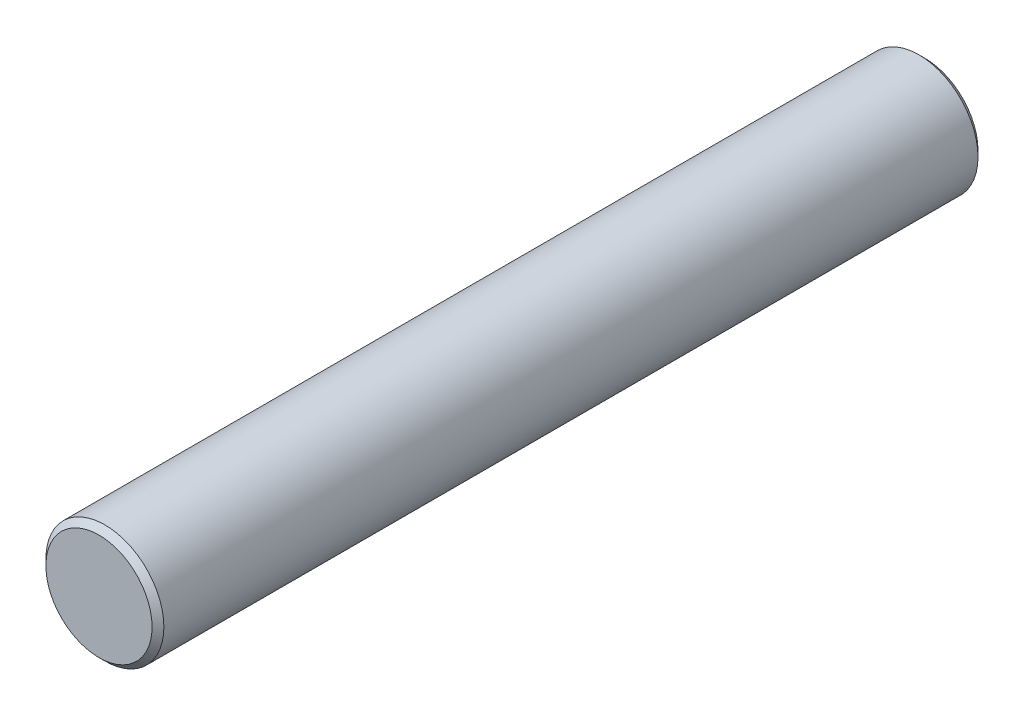
ISO-10303-21;
HEADER;
FILE_DESCRIPTION(('STEP AP214'),'2;1');
FILE_NAME('part.step','',(''),(''),'','','');
FILE_SCHEMA(('AUTOMOTIVE_DESIGN { 1 0 10303 214 1 1 1 1 }'));
ENDSEC;
DATA;
#1=APPLICATION_CONTEXT('core data for automotive mechanical design processes');
#2=APPLICATION_PROTOCOL_DEFINITION('international standard','automotive_design',2000,#1);
#3=PRODUCT_CONTEXT('',#1,'mechanical');
#4=PRODUCT('Part','Part','',(#3));
#5=PRODUCT_RELATED_PRODUCT_CATEGORY('part','',(#4));
#6=PRODUCT_DEFINITION_FORMATION('','',#4);
#7=PRODUCT_DEFINITION_CONTEXT('part definition',#1,'design');
#8=PRODUCT_DEFINITION('design','',#6,#7);
#9=PRODUCT_DEFINITION_SHAPE('','',#8);
#10=(LENGTH_UNIT() NAMED_UNIT(*) SI_UNIT(.MILLI.,.METRE.));
#11=(NAMED_UNIT(*) PLANE_ANGLE_UNIT() SI_UNIT($,.RADIAN.));
#12=(NAMED_UNIT(*) SI_UNIT($,.STERADIAN.) SOLID_ANGLE_UNIT());
#13=UNCERTAINTY_MEASURE_WITH_UNIT(LENGTH_MEASURE(1.E-05),#10,'distance_accuracy_value','');
#14=(GEOMETRIC_REPRESENTATION_CONTEXT(3) GLOBAL_UNCERTAINTY_ASSIGNED_CONTEXT((#13)) GLOBAL_UNIT_ASSIGNED_CONTEXT((#10,
#11,#12)) REPRESENTATION_CONTEXT('',''));
#15=CARTESIAN_POINT('',(0.,0.,0.));
#16=DIRECTION('',(0.,0.,1.));
#17=DIRECTION('',(1.,0.,0.));
#18=AXIS2_PLACEMENT_3D('',#15,#16,#17);
#19=CARTESIAN_POINT('',(0.,0.,35.));
#20=DIRECTION('',(0.,0.,-1.));
#21=DIRECTION('',(-1.,0.,0.));
#22=AXIS2_PLACEMENT_3D('',#19,#20,#21);
#23=CYLINDRICAL_SURFACE('',#22,2.5);
#24=CARTESIAN_POINT('',(0.,0.,0.25));
#25=DIRECTION('',(0.,0.,1.));
#26=DIRECTION('',(1.,0.,0.));
#27=AXIS2_PLACEMENT_3D('',#24,#25,#26);
#28=CIRCLE('',#27,2.5);
#29=CARTESIAN_POINT('',(2.5,0.,0.25));
#30=VERTEX_POINT('',#29);
#31=EDGE_CURVE('E42',#30,#30,#28,.T.);
#32=ORIENTED_EDGE('',*,*,#31,.T.);
#33=EDGE_LOOP('',(#32));
#34=FACE_BOUND('',#33,.T.);
#35=CARTESIAN_POINT('',(0.,0.,34.75));
#36=DIRECTION('',(0.,0.,1.));
#37=DIRECTION('',(1.,0.,0.));
#38=AXIS2_PLACEMENT_3D('',#35,#36,#37);
#39=CIRCLE('',#38,2.5);
#40=CARTESIAN_POINT('',(2.5,0.,34.75));
#41=VERTEX_POINT('',#40);
#42=EDGE_CURVE('E46',#41,#41,#39,.F.);
#43=ORIENTED_EDGE('',*,*,#42,.T.);
#44=EDGE_LOOP('',(#43));
#45=FACE_BOUND('',#44,.T.);
#46=ADVANCED_FACE('F31',(#34,#45),#23,.T.);
#47=CARTESIAN_POINT('',(0.,0.,35.));
#48=DIRECTION('',(0.,0.,1.));
#49=DIRECTION('',(1.,0.,0.));
#50=AXIS2_PLACEMENT_3D('',#47,#48,#49);
#51=PLANE('',#50);
#52=CARTESIAN_POINT('',(0.,0.,35.));
#53=DIRECTION('',(0.,0.,1.));
#54=DIRECTION('',(1.,0.,0.));
#55=AXIS2_PLACEMENT_3D('',#52,#53,#54);
#56=CIRCLE('',#55,2.25);
#57=CARTESIAN_POINT('',(2.25,0.,35.));
#58=VERTEX_POINT('',#57);
#59=EDGE_CURVE('E10',#58,#58,#56,.T.);
#60=ORIENTED_EDGE('',*,*,#59,.T.);
#61=EDGE_LOOP('',(#60));
#62=FACE_BOUND('',#61,.T.);
#63=ADVANCED_FACE('F62',(#62),#51,.T.);
#64=CARTESIAN_POINT('',(0.,0.,0.));
#65=DIRECTION('',(0.,0.,1.));
#66=DIRECTION('',(1.,0.,0.));
#67=AXIS2_PLACEMENT_3D('',#64,#65,#66);
#68=PLANE('',#67);
#69=CARTESIAN_POINT('',(0.,0.,0.));
#70=DIRECTION('',(0.,0.,1.));
#71=DIRECTION('',(1.,0.,0.));
#72=AXIS2_PLACEMENT_3D('',#69,#70,#71);
#73=CIRCLE('',#72,2.25);
#74=CARTESIAN_POINT('',(2.25,0.,0.));
#75=VERTEX_POINT('',#74);
#76=EDGE_CURVE('E38',#75,#75,#73,.F.);
#77=ORIENTED_EDGE('',*,*,#76,.T.);
#78=EDGE_LOOP('',(#77));
#79=FACE_BOUND('',#78,.T.);
#80=ADVANCED_FACE('F59',(#79),#68,.F.);
#81=CARTESIAN_POINT('',(0.,0.,0.25));
#82=DIRECTION('',(0.,0.,1.));
#83=DIRECTION('',(1.,0.,0.));
#84=AXIS2_PLACEMENT_3D('',#81,#82,#83);
#85=CONICAL_SURFACE('',#84,2.5,0.785398163397444);
#86=ORIENTED_EDGE('',*,*,#76,.F.);
#87=EDGE_LOOP('',(#86));
#88=FACE_BOUND('',#87,.T.);
#89=ORIENTED_EDGE('',*,*,#31,.F.);
#90=EDGE_LOOP('',(#89));
#91=FACE_BOUND('',#90,.T.);
#92=ADVANCED_FACE('F55',(#88,#91),#85,.T.);
#93=CARTESIAN_POINT('',(0.,0.,35.));
#94=DIRECTION('',(0.,0.,-1.));
#95=DIRECTION('',(-1.,0.,0.));
#96=AXIS2_PLACEMENT_3D('',#93,#94,#95);
#97=CONICAL_SURFACE('',#96,2.25,0.785398163397444);
#98=ORIENTED_EDGE('',*,*,#42,.F.);
#99=EDGE_LOOP('',(#98));
#100=FACE_BOUND('',#99,.T.);
#101=ORIENTED_EDGE('',*,*,#59,.F.);
#102=EDGE_LOOP('',(#101));
#103=FACE_BOUND('',#102,.T.);
#104=ADVANCED_FACE('F33',(#100,#103),#97,.T.);
#105=CLOSED_SHELL('',(#46,#63,#80,#92,#104));
#106=MANIFOLD_SOLID_BREP('B2',#105);
#107=ADVANCED_BREP_SHAPE_REPRESENTATION('',(#18,#106),#14);
#108=SHAPE_DEFINITION_REPRESENTATION(#9,#107);
ENDSEC;
END-ISO-10303-21;
